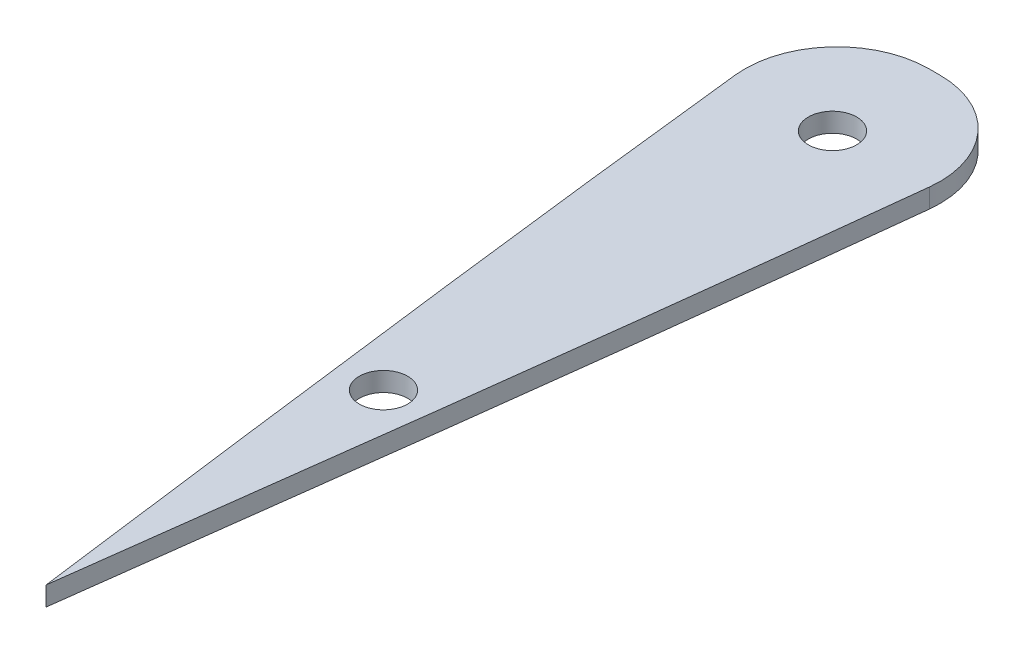
ISO-10303-21;
HEADER;
FILE_DESCRIPTION(('STEP AP214'),'2;1');
FILE_NAME('part.step','',(''),(''),'','','');
FILE_SCHEMA(('AUTOMOTIVE_DESIGN { 1 0 10303 214 1 1 1 1 }'));
ENDSEC;
DATA;
#1=APPLICATION_CONTEXT('core data for automotive mechanical design processes');
#2=APPLICATION_PROTOCOL_DEFINITION('international standard','automotive_design',2000,#1);
#3=PRODUCT_CONTEXT('',#1,'mechanical');
#4=PRODUCT('Part','Part','',(#3));
#5=PRODUCT_RELATED_PRODUCT_CATEGORY('part','',(#4));
#6=PRODUCT_DEFINITION_FORMATION('','',#4);
#7=PRODUCT_DEFINITION_CONTEXT('part definition',#1,'design');
#8=PRODUCT_DEFINITION('design','',#6,#7);
#9=PRODUCT_DEFINITION_SHAPE('','',#8);
#10=(LENGTH_UNIT() NAMED_UNIT(*) SI_UNIT(.MILLI.,.METRE.));
#11=(NAMED_UNIT(*) PLANE_ANGLE_UNIT() SI_UNIT($,.RADIAN.));
#12=(NAMED_UNIT(*) SI_UNIT($,.STERADIAN.) SOLID_ANGLE_UNIT());
#13=UNCERTAINTY_MEASURE_WITH_UNIT(LENGTH_MEASURE(1.E-05),#10,'distance_accuracy_value','');
#14=(GEOMETRIC_REPRESENTATION_CONTEXT(3) GLOBAL_UNCERTAINTY_ASSIGNED_CONTEXT((#13)) GLOBAL_UNIT_ASSIGNED_CONTEXT((#10,
#11,#12)) REPRESENTATION_CONTEXT('',''));
#15=CARTESIAN_POINT('',(0.,0.,0.));
#16=DIRECTION('',(0.,0.,1.));
#17=DIRECTION('',(1.,0.,0.));
#18=AXIS2_PLACEMENT_3D('',#15,#16,#17);
#19=CARTESIAN_POINT('',(1.10809611059364,169.87266,71.9337783562964));
#20=DIRECTION('',(0.,-1.,0.));
#21=DIRECTION('',(0.,0.,-1.));
#22=AXIS2_PLACEMENT_3D('',#19,#20,#21);
#23=CYLINDRICAL_SURFACE('',#22,2.);
#24=CARTESIAN_POINT('',(1.10809611059364,159.28483333274,71.9337783562964));
#25=DIRECTION('',(0.,1.,0.));
#26=DIRECTION('',(0.,0.,1.));
#27=AXIS2_PLACEMENT_3D('',#24,#25,#26);
#28=CIRCLE('',#27,2.);
#29=CARTESIAN_POINT('',(1.10809611059364,159.28483333274,69.9337783562964));
#30=VERTEX_POINT('',#29);
#31=EDGE_CURVE('E43',#30,#30,#28,.F.);
#32=CARTESIAN_POINT('',(1.10809611059364,160.87233333274,71.9337783562964));
#33=DIRECTION('',(0.,-1.,0.));
#34=DIRECTION('',(0.,0.,-1.));
#35=AXIS2_PLACEMENT_3D('',#32,#33,#34);
#36=CIRCLE('',#35,2.);
#37=CARTESIAN_POINT('',(1.10809611059364,160.87233333274,69.9337783562964));
#38=VERTEX_POINT('',#37);
#39=EDGE_CURVE('E130',#38,#38,#36,.F.);
#40=CARTESIAN_POINT('',(1.10809611059364,159.28483333274,69.9337783562964));
#41=CARTESIAN_POINT('',(1.10809611059364,159.301369791073,69.9337783562964));
#42=CARTESIAN_POINT('',(1.10809611059364,159.317906249407,69.9337783562964));
#43=CARTESIAN_POINT('',(1.10809611059364,159.350979166073,69.9337783562964));
#44=CARTESIAN_POINT('',(1.10809611059364,159.367515624407,69.9337783562964));
#45=CARTESIAN_POINT('',(1.10809611059364,159.400588541073,69.9337783562964));
#46=CARTESIAN_POINT('',(1.10809611059364,159.417124999407,69.9337783562964));
#47=CARTESIAN_POINT('',(1.10809611059364,159.450197916073,69.9337783562964));
#48=CARTESIAN_POINT('',(1.10809611059364,159.466734374407,69.9337783562964));
#49=CARTESIAN_POINT('',(1.10809611059364,159.499807291073,69.9337783562964));
#50=CARTESIAN_POINT('',(1.10809611059364,159.516343749407,69.9337783562964));
#51=CARTESIAN_POINT('',(1.10809611059364,159.549416666073,69.9337783562964));
#52=CARTESIAN_POINT('',(1.10809611059364,159.565953124407,69.9337783562964));
#53=CARTESIAN_POINT('',(1.10809611059364,159.599026041073,69.9337783562964));
#54=CARTESIAN_POINT('',(1.10809611059364,159.615562499407,69.9337783562964));
#55=CARTESIAN_POINT('',(1.10809611059364,159.648635416073,69.9337783562964));
#56=CARTESIAN_POINT('',(1.10809611059364,159.665171874407,69.9337783562964));
#57=CARTESIAN_POINT('',(1.10809611059364,159.698244791073,69.9337783562964));
#58=CARTESIAN_POINT('',(1.10809611059364,159.714781249407,69.9337783562964));
#59=CARTESIAN_POINT('',(1.10809611059364,159.747854166073,69.9337783562964));
#60=CARTESIAN_POINT('',(1.10809611059364,159.764390624407,69.9337783562964));
#61=CARTESIAN_POINT('',(1.10809611059364,159.797463541073,69.9337783562964));
#62=CARTESIAN_POINT('',(1.10809611059364,159.813999999407,69.9337783562964));
#63=CARTESIAN_POINT('',(1.10809611059364,159.847072916073,69.9337783562964));
#64=CARTESIAN_POINT('',(1.10809611059364,159.863609374407,69.9337783562964));
#65=CARTESIAN_POINT('',(1.10809611059364,159.896682291073,69.9337783562964));
#66=CARTESIAN_POINT('',(1.10809611059364,159.913218749407,69.9337783562964));
#67=CARTESIAN_POINT('',(1.10809611059364,159.946291666073,69.9337783562964));
#68=CARTESIAN_POINT('',(1.10809611059364,159.962828124407,69.9337783562964));
#69=CARTESIAN_POINT('',(1.10809611059364,159.995901041073,69.9337783562964));
#70=CARTESIAN_POINT('',(1.10809611059364,160.012437499407,69.9337783562964));
#71=CARTESIAN_POINT('',(1.10809611059364,160.045510416073,69.9337783562964));
#72=CARTESIAN_POINT('',(1.10809611059364,160.062046874407,69.9337783562964));
#73=CARTESIAN_POINT('',(1.10809611059364,160.095119791073,69.9337783562964));
#74=CARTESIAN_POINT('',(1.10809611059364,160.111656249407,69.9337783562964));
#75=CARTESIAN_POINT('',(1.10809611059364,160.144729166073,69.9337783562964));
#76=CARTESIAN_POINT('',(1.10809611059364,160.161265624407,69.9337783562964));
#77=CARTESIAN_POINT('',(1.10809611059364,160.194338541073,69.9337783562964));
#78=CARTESIAN_POINT('',(1.10809611059364,160.210874999407,69.9337783562964));
#79=CARTESIAN_POINT('',(1.10809611059364,160.243947916073,69.9337783562964));
#80=CARTESIAN_POINT('',(1.10809611059364,160.260484374407,69.9337783562964));
#81=CARTESIAN_POINT('',(1.10809611059364,160.293557291073,69.9337783562964));
#82=CARTESIAN_POINT('',(1.10809611059364,160.310093749407,69.9337783562964));
#83=CARTESIAN_POINT('',(1.10809611059364,160.343166666073,69.9337783562964));
#84=CARTESIAN_POINT('',(1.10809611059364,160.359703124407,69.9337783562964));
#85=CARTESIAN_POINT('',(1.10809611059364,160.392776041073,69.9337783562964));
#86=CARTESIAN_POINT('',(1.10809611059364,160.409312499407,69.9337783562964));
#87=CARTESIAN_POINT('',(1.10809611059364,160.442385416073,69.9337783562964));
#88=CARTESIAN_POINT('',(1.10809611059364,160.458921874407,69.9337783562964));
#89=CARTESIAN_POINT('',(1.10809611059364,160.491994791073,69.9337783562964));
#90=CARTESIAN_POINT('',(1.10809611059364,160.508531249407,69.9337783562964));
#91=CARTESIAN_POINT('',(1.10809611059364,160.541604166073,69.9337783562964));
#92=CARTESIAN_POINT('',(1.10809611059364,160.558140624407,69.9337783562964));
#93=CARTESIAN_POINT('',(1.10809611059364,160.591213541073,69.9337783562964));
#94=CARTESIAN_POINT('',(1.10809611059364,160.607749999407,69.9337783562964));
#95=CARTESIAN_POINT('',(1.10809611059364,160.640822916073,69.9337783562964));
#96=CARTESIAN_POINT('',(1.10809611059364,160.657359374407,69.9337783562964));
#97=CARTESIAN_POINT('',(1.10809611059364,160.690432291073,69.9337783562964));
#98=CARTESIAN_POINT('',(1.10809611059364,160.706968749407,69.9337783562964));
#99=CARTESIAN_POINT('',(1.10809611059364,160.740041666073,69.9337783562964));
#100=CARTESIAN_POINT('',(1.10809611059364,160.756578124407,69.9337783562964));
#101=CARTESIAN_POINT('',(1.10809611059364,160.789651041073,69.9337783562964));
#102=CARTESIAN_POINT('',(1.10809611059364,160.806187499407,69.9337783562964));
#103=CARTESIAN_POINT('',(1.10809611059364,160.839260416073,69.9337783562964));
#104=CARTESIAN_POINT('',(1.10809611059364,160.855796874407,69.9337783562964));
#105=CARTESIAN_POINT('',(1.10809611059364,160.87233333274,69.9337783562964));
#106=B_SPLINE_CURVE_WITH_KNOTS('',3,(#40,#41,#42,#43,#44,#45,#46,#47,#48,#49,#50,#51,#52,#53,
#54,#55,#56,#57,#58,#59,#60,#61,#62,#63,#64,#65,#66,#67,#68,#69,#70,#71,#72,#73,#74,#75,#76,#77,
#78,#79,#80,#81,#82,#83,#84,#85,#86,#87,#88,#89,#90,#91,#92,#93,#94,#95,#96,#97,#98,#99,#100,
#101,#102,#103,#104,#105),.UNSPECIFIED.,.F.,.F.,(4,2,2,2,2,2,2,2,2,2,2,2,2,2,2,2,2,2,2,2,2,2,2,
2,2,2,2,2,2,2,2,2,4),(0.,0.0496093750000093,0.0992187500000186,0.148828125000028,
0.198437500000009,0.248046875000019,0.297656250000028,0.347265625000009,0.396875000000019,
0.446484375000028,0.49609375000001,0.545703125000019,0.595312500000028,0.64492187500001,
0.694531250000019,0.744140625000028,0.79375000000001,0.843359375000019,0.892968750000028,
0.94257812500001,0.992187500000019,1.04179687500003,1.09140625000004,1.14101562500002,
1.19062500000003,1.24023437500004,1.28984375000002,1.33945312500003,1.38906250000004,
1.43867187500002,1.48828125000003,1.53789062500004,1.58750000000002),.UNSPECIFIED.);
#107=EDGE_CURVE('BSEAM39',#30,#38,#106,.T.);
#108=ORIENTED_EDGE('',*,*,#31,.T.);
#109=ORIENTED_EDGE('',*,*,#39,.T.);
#110=ORIENTED_EDGE('',*,*,#107,.T.);
#111=ORIENTED_EDGE('',*,*,#107,.F.);
#112=EDGE_LOOP('',(#108,#110,#109,#111));
#113=FACE_BOUND('',#112,.T.);
#114=ADVANCED_FACE('F39',(#113),#23,.F.);
#115=CARTESIAN_POINT('',(-9.25951888196291,160.87233333274,99.8737783562964));
#116=DIRECTION('',(0.,-1.,0.));
#117=DIRECTION('',(0.,0.,-1.));
#118=AXIS2_PLACEMENT_3D('',#115,#116,#117);
#119=PLANE('',#118);
#120=CARTESIAN_POINT('',(0.649492403151799,160.87233333274,33.932456678177));
#121=DIRECTION('',(0.,-1.,0.));
#122=DIRECTION('',(0.,0.,-1.));
#123=AXIS2_PLACEMENT_3D('',#120,#121,#122);
#124=CIRCLE('',#123,7.62);
#125=CARTESIAN_POINT('',(0.6494924031518,160.87233333274,26.312456678177));
#126=VERTEX_POINT('',#125);
#127=CARTESIAN_POINT('',(-6.9253777548343,160.87233333274,34.7605521374397));
#128=VERTEX_POINT('',#127);
#129=EDGE_CURVE('E91',#126,#128,#124,.F.);
#130=ORIENTED_EDGE('',*,*,#129,.T.);
#131=CARTESIAN_POINT('',(-8.38670742850917,160.87233333274,20.7524515728352));
#132=CARTESIAN_POINT('',(-5.77036767929202,160.87233333274,47.1872196515421));
#133=CARTESIAN_POINT('',(-2.31115252231645,160.87233333274,73.5317641629202));
#134=CARTESIAN_POINT('',(1.10809611059364,160.87233333274,99.8737783562964));
#135=B_SPLINE_CURVE_WITH_KNOTS('',3,(#131,#132,#133,#134),.UNSPECIFIED.,.F.,.F.,(4,4),(0.,
0.384969625903912),.UNSPECIFIED.);
#136=CARTESIAN_POINT('',(1.10809611059364,160.87233333274,99.8737783562964));
#137=VERTEX_POINT('',#136);
#138=EDGE_CURVE('E87',#137,#128,#135,.F.);
#139=ORIENTED_EDGE('',*,*,#138,.F.);
#140=CARTESIAN_POINT('',(1.10809611059364,160.87233333274,99.8737783562964));
#141=CARTESIAN_POINT('',(4.52734474351301,160.87233333274,73.5317641629186));
#142=CARTESIAN_POINT('',(7.98655990047842,160.87233333274,47.187219651543));
#143=CARTESIAN_POINT('',(10.6028996496958,160.87233333274,20.7524515728353));
#144=B_SPLINE_CURVE_WITH_KNOTS('',3,(#140,#141,#142,#143),.UNSPECIFIED.,.F.,.F.,(4,4),(0.,
0.384969625903911),.UNSPECIFIED.);
#145=CARTESIAN_POINT('',(9.14156997602183,160.87233333274,34.7605521374382));
#146=VERTEX_POINT('',#145);
#147=EDGE_CURVE('E57',#146,#137,#144,.F.);
#148=ORIENTED_EDGE('',*,*,#147,.F.);
#149=CARTESIAN_POINT('',(1.56669981803556,160.87233333274,33.932456678177));
#150=DIRECTION('',(0.,-1.,0.));
#151=DIRECTION('',(0.,0.,-1.));
#152=AXIS2_PLACEMENT_3D('',#149,#150,#151);
#153=CIRCLE('',#152,7.62);
#154=CARTESIAN_POINT('',(1.56669981803556,160.87233333274,26.312456678177));
#155=VERTEX_POINT('',#154);
#156=EDGE_CURVE('E138',#146,#155,#153,.F.);
#157=ORIENTED_EDGE('',*,*,#156,.T.);
#158=DIRECTION('',(1.,0.,0.));
#159=VECTOR('',#158,1.);
#160=CARTESIAN_POINT('',(-9.95528734648911,160.87233333274,26.312456678177));
#161=LINE('',#160,#159);
#162=EDGE_CURVE('E107',#126,#155,#161,.T.);
#163=ORIENTED_EDGE('',*,*,#162,.F.);
#164=EDGE_LOOP('',(#130,#139,#148,#157,#163));
#165=FACE_BOUND('',#164,.T.);
#166=ORIENTED_EDGE('',*,*,#39,.F.);
#167=EDGE_LOOP('',(#166));
#168=FACE_BOUND('',#167,.T.);
#169=CARTESIAN_POINT('',(1.10809611059364,160.87233333274,34.7605521374395));
#170=DIRECTION('',(0.,-1.,0.));
#171=DIRECTION('',(0.,0.,-1.));
#172=AXIS2_PLACEMENT_3D('',#169,#170,#171);
#173=CIRCLE('',#172,2.);
#174=CARTESIAN_POINT('',(1.10809611059364,160.87233333274,32.7605521374395));
#175=VERTEX_POINT('',#174);
#176=EDGE_CURVE('E133',#175,#175,#173,.F.);
#177=ORIENTED_EDGE('',*,*,#176,.F.);
#178=EDGE_LOOP('',(#177));
#179=FACE_BOUND('',#178,.T.);
#180=ADVANCED_FACE('F88',(#165,#168,#179),#119,.F.);
#181=CARTESIAN_POINT('',(-9.25951888196291,159.28483333274,99.8737783562964));
#182=DIRECTION('',(0.,1.,0.));
#183=DIRECTION('',(0.,0.,1.));
#184=AXIS2_PLACEMENT_3D('',#181,#182,#183);
#185=PLANE('',#184);
#186=CARTESIAN_POINT('',(0.649492403151799,159.28483333274,33.932456678177));
#187=DIRECTION('',(0.,1.,0.));
#188=DIRECTION('',(0.,0.,1.));
#189=AXIS2_PLACEMENT_3D('',#186,#187,#188);
#190=CIRCLE('',#189,7.62);
#191=CARTESIAN_POINT('',(-6.9253777548343,159.28483333274,34.7605521374397));
#192=VERTEX_POINT('',#191);
#193=CARTESIAN_POINT('',(0.6494924031518,159.28483333274,26.312456678177));
#194=VERTEX_POINT('',#193);
#195=EDGE_CURVE('E114',#192,#194,#190,.F.);
#196=ORIENTED_EDGE('',*,*,#195,.T.);
#197=DIRECTION('',(-1.,0.,0.));
#198=VECTOR('',#197,1.);
#199=CARTESIAN_POINT('',(-9.95528734648911,159.28483333274,26.312456678177));
#200=LINE('',#199,#198);
#201=CARTESIAN_POINT('',(1.56669981803556,159.28483333274,26.312456678177));
#202=VERTEX_POINT('',#201);
#203=EDGE_CURVE('E65',#202,#194,#200,.T.);
#204=ORIENTED_EDGE('',*,*,#203,.F.);
#205=CARTESIAN_POINT('',(1.56669981803556,159.28483333274,33.932456678177));
#206=DIRECTION('',(0.,1.,0.));
#207=DIRECTION('',(0.,0.,1.));
#208=AXIS2_PLACEMENT_3D('',#205,#206,#207);
#209=CIRCLE('',#208,7.62);
#210=CARTESIAN_POINT('',(9.1415699760218,159.28483333274,34.7605521374385));
#211=VERTEX_POINT('',#210);
#212=EDGE_CURVE('E164',#202,#211,#209,.F.);
#213=ORIENTED_EDGE('',*,*,#212,.T.);
#214=CARTESIAN_POINT('',(1.10809611059364,159.28483333274,99.8737783562964));
#215=CARTESIAN_POINT('',(4.52734474351301,159.28483333274,73.5317641629186));
#216=CARTESIAN_POINT('',(7.98655990047842,159.28483333274,47.187219651543));
#217=CARTESIAN_POINT('',(10.6028996496958,159.28483333274,20.7524515728353));
#218=B_SPLINE_CURVE_WITH_KNOTS('',3,(#214,#215,#216,#217),.UNSPECIFIED.,.F.,.F.,(4,4),(0.,
0.384969625903911),.UNSPECIFIED.);
#219=CARTESIAN_POINT('',(1.10809611059364,159.28483333274,99.8737783562964));
#220=VERTEX_POINT('',#219);
#221=EDGE_CURVE('E169',#220,#211,#218,.T.);
#222=ORIENTED_EDGE('',*,*,#221,.F.);
#223=CARTESIAN_POINT('',(-8.38670742850917,159.28483333274,20.7524515728352));
#224=CARTESIAN_POINT('',(-5.77036767929202,159.28483333274,47.1872196515421));
#225=CARTESIAN_POINT('',(-2.31115252231645,159.28483333274,73.5317641629202));
#226=CARTESIAN_POINT('',(1.10809611059364,159.28483333274,99.8737783562964));
#227=B_SPLINE_CURVE_WITH_KNOTS('',3,(#223,#224,#225,#226),.UNSPECIFIED.,.F.,.F.,(4,4),(0.,
0.384969625903912),.UNSPECIFIED.);
#228=EDGE_CURVE('E111',#192,#220,#227,.T.);
#229=ORIENTED_EDGE('',*,*,#228,.F.);
#230=EDGE_LOOP('',(#196,#204,#213,#222,#229));
#231=FACE_BOUND('',#230,.T.);
#232=ORIENTED_EDGE('',*,*,#31,.F.);
#233=EDGE_LOOP('',(#232));
#234=FACE_BOUND('',#233,.T.);
#235=CARTESIAN_POINT('',(1.10809611059364,159.28483333274,34.7605521374395));
#236=DIRECTION('',(0.,1.,0.));
#237=DIRECTION('',(0.,0.,1.));
#238=AXIS2_PLACEMENT_3D('',#235,#236,#237);
#239=CIRCLE('',#238,2.);
#240=CARTESIAN_POINT('',(1.10809611059364,159.28483333274,32.7605521374395));
#241=VERTEX_POINT('',#240);
#242=EDGE_CURVE('E160',#241,#241,#239,.F.);
#243=ORIENTED_EDGE('',*,*,#242,.F.);
#244=EDGE_LOOP('',(#243));
#245=FACE_BOUND('',#244,.T.);
#246=ADVANCED_FACE('F211',(#231,#234,#245),#185,.F.);
#247=CARTESIAN_POINT('',(1.10809611059364,169.87266,34.7605521374395));
#248=DIRECTION('',(0.,-1.,0.));
#249=DIRECTION('',(0.,0.,-1.));
#250=AXIS2_PLACEMENT_3D('',#247,#248,#249);
#251=CYLINDRICAL_SURFACE('',#250,2.);
#252=CARTESIAN_POINT('',(1.10809611059364,159.28483333274,32.7605521374395));
#253=CARTESIAN_POINT('',(1.10809611059364,159.301369791073,32.7605521374395));
#254=CARTESIAN_POINT('',(1.10809611059364,159.317906249407,32.7605521374395));
#255=CARTESIAN_POINT('',(1.10809611059364,159.350979166073,32.7605521374395));
#256=CARTESIAN_POINT('',(1.10809611059364,159.367515624407,32.7605521374395));
#257=CARTESIAN_POINT('',(1.10809611059364,159.400588541073,32.7605521374395));
#258=CARTESIAN_POINT('',(1.10809611059364,159.417124999407,32.7605521374395));
#259=CARTESIAN_POINT('',(1.10809611059364,159.450197916073,32.7605521374395));
#260=CARTESIAN_POINT('',(1.10809611059364,159.466734374407,32.7605521374395));
#261=CARTESIAN_POINT('',(1.10809611059364,159.499807291073,32.7605521374395));
#262=CARTESIAN_POINT('',(1.10809611059364,159.516343749407,32.7605521374395));
#263=CARTESIAN_POINT('',(1.10809611059364,159.549416666073,32.7605521374395));
#264=CARTESIAN_POINT('',(1.10809611059364,159.565953124407,32.7605521374395));
#265=CARTESIAN_POINT('',(1.10809611059364,159.599026041073,32.7605521374395));
#266=CARTESIAN_POINT('',(1.10809611059364,159.615562499407,32.7605521374395));
#267=CARTESIAN_POINT('',(1.10809611059364,159.648635416073,32.7605521374395));
#268=CARTESIAN_POINT('',(1.10809611059364,159.665171874407,32.7605521374395));
#269=CARTESIAN_POINT('',(1.10809611059364,159.698244791073,32.7605521374395));
#270=CARTESIAN_POINT('',(1.10809611059364,159.714781249407,32.7605521374395));
#271=CARTESIAN_POINT('',(1.10809611059364,159.747854166073,32.7605521374395));
#272=CARTESIAN_POINT('',(1.10809611059364,159.764390624407,32.7605521374395));
#273=CARTESIAN_POINT('',(1.10809611059364,159.797463541073,32.7605521374395));
#274=CARTESIAN_POINT('',(1.10809611059364,159.813999999407,32.7605521374395));
#275=CARTESIAN_POINT('',(1.10809611059364,159.847072916073,32.7605521374395));
#276=CARTESIAN_POINT('',(1.10809611059364,159.863609374407,32.7605521374395));
#277=CARTESIAN_POINT('',(1.10809611059364,159.896682291073,32.7605521374395));
#278=CARTESIAN_POINT('',(1.10809611059364,159.913218749407,32.7605521374395));
#279=CARTESIAN_POINT('',(1.10809611059364,159.946291666073,32.7605521374395));
#280=CARTESIAN_POINT('',(1.10809611059364,159.962828124407,32.7605521374395));
#281=CARTESIAN_POINT('',(1.10809611059364,159.995901041073,32.7605521374395));
#282=CARTESIAN_POINT('',(1.10809611059364,160.012437499407,32.7605521374395));
#283=CARTESIAN_POINT('',(1.10809611059364,160.045510416073,32.7605521374395));
#284=CARTESIAN_POINT('',(1.10809611059364,160.062046874407,32.7605521374395));
#285=CARTESIAN_POINT('',(1.10809611059364,160.095119791073,32.7605521374395));
#286=CARTESIAN_POINT('',(1.10809611059364,160.111656249407,32.7605521374395));
#287=CARTESIAN_POINT('',(1.10809611059364,160.144729166073,32.7605521374395));
#288=CARTESIAN_POINT('',(1.10809611059364,160.161265624407,32.7605521374395));
#289=CARTESIAN_POINT('',(1.10809611059364,160.194338541073,32.7605521374395));
#290=CARTESIAN_POINT('',(1.10809611059364,160.210874999407,32.7605521374395));
#291=CARTESIAN_POINT('',(1.10809611059364,160.243947916073,32.7605521374395));
#292=CARTESIAN_POINT('',(1.10809611059364,160.260484374407,32.7605521374395));
#293=CARTESIAN_POINT('',(1.10809611059364,160.293557291073,32.7605521374395));
#294=CARTESIAN_POINT('',(1.10809611059364,160.310093749407,32.7605521374395));
#295=CARTESIAN_POINT('',(1.10809611059364,160.343166666073,32.7605521374395));
#296=CARTESIAN_POINT('',(1.10809611059364,160.359703124407,32.7605521374395));
#297=CARTESIAN_POINT('',(1.10809611059364,160.392776041073,32.7605521374395));
#298=CARTESIAN_POINT('',(1.10809611059364,160.409312499407,32.7605521374395));
#299=CARTESIAN_POINT('',(1.10809611059364,160.442385416073,32.7605521374395));
#300=CARTESIAN_POINT('',(1.10809611059364,160.458921874407,32.7605521374395));
#301=CARTESIAN_POINT('',(1.10809611059364,160.491994791073,32.7605521374395));
#302=CARTESIAN_POINT('',(1.10809611059364,160.508531249407,32.7605521374395));
#303=CARTESIAN_POINT('',(1.10809611059364,160.541604166073,32.7605521374395));
#304=CARTESIAN_POINT('',(1.10809611059364,160.558140624407,32.7605521374395));
#305=CARTESIAN_POINT('',(1.10809611059364,160.591213541073,32.7605521374395));
#306=CARTESIAN_POINT('',(1.10809611059364,160.607749999407,32.7605521374395));
#307=CARTESIAN_POINT('',(1.10809611059364,160.640822916073,32.7605521374395));
#308=CARTESIAN_POINT('',(1.10809611059364,160.657359374407,32.7605521374395));
#309=CARTESIAN_POINT('',(1.10809611059364,160.690432291073,32.7605521374395));
#310=CARTESIAN_POINT('',(1.10809611059364,160.706968749407,32.7605521374395));
#311=CARTESIAN_POINT('',(1.10809611059364,160.740041666073,32.7605521374395));
#312=CARTESIAN_POINT('',(1.10809611059364,160.756578124407,32.7605521374395));
#313=CARTESIAN_POINT('',(1.10809611059364,160.789651041073,32.7605521374395));
#314=CARTESIAN_POINT('',(1.10809611059364,160.806187499407,32.7605521374395));
#315=CARTESIAN_POINT('',(1.10809611059364,160.839260416073,32.7605521374395));
#316=CARTESIAN_POINT('',(1.10809611059364,160.855796874407,32.7605521374395));
#317=CARTESIAN_POINT('',(1.10809611059364,160.87233333274,32.7605521374395));
#318=B_SPLINE_CURVE_WITH_KNOTS('',3,(#252,#253,#254,#255,#256,#257,#258,#259,#260,#261,#262,
#263,#264,#265,#266,#267,#268,#269,#270,#271,#272,#273,#274,#275,#276,#277,#278,#279,#280,#281,
#282,#283,#284,#285,#286,#287,#288,#289,#290,#291,#292,#293,#294,#295,#296,#297,#298,#299,#300,
#301,#302,#303,#304,#305,#306,#307,#308,#309,#310,#311,#312,#313,#314,#315,#316,#317),
.UNSPECIFIED.,.F.,.F.,(4,2,2,2,2,2,2,2,2,2,2,2,2,2,2,2,2,2,2,2,2,2,2,2,2,2,2,2,2,2,2,2,4),(0.,
0.0496093750000093,0.0992187500000186,0.148828125000028,0.198437500000009,0.248046875000019,
0.297656250000028,0.347265625000009,0.396875000000019,0.446484375000028,0.49609375000001,
0.545703125000019,0.595312500000028,0.64492187500001,0.694531250000019,0.744140625000028,
0.79375000000001,0.843359375000019,0.892968750000028,0.94257812500001,0.992187500000019,
1.04179687500003,1.09140625000004,1.14101562500002,1.19062500000003,1.24023437500004,
1.28984375000002,1.33945312500003,1.38906250000004,1.43867187500002,1.48828125000003,
1.53789062500004,1.58750000000002),.UNSPECIFIED.);
#319=EDGE_CURVE('BSEAM192',#241,#175,#318,.T.);
#320=ORIENTED_EDGE('',*,*,#242,.T.);
#321=ORIENTED_EDGE('',*,*,#176,.T.);
#322=ORIENTED_EDGE('',*,*,#319,.T.);
#323=ORIENTED_EDGE('',*,*,#319,.F.);
#324=EDGE_LOOP('',(#320,#322,#321,#323));
#325=FACE_BOUND('',#324,.T.);
#326=ADVANCED_FACE('F192',(#325),#251,.F.);
#327=CARTESIAN_POINT('',(-8.38670742850917,169.87266,20.7524515728352));
#328=CARTESIAN_POINT('',(-5.77036767929202,169.87266,47.1872196515421));
#329=CARTESIAN_POINT('',(-2.31115252231645,169.87266,73.5317641629202));
#330=CARTESIAN_POINT('',(1.10809611059364,169.87266,99.8737783562964));
#331=B_SPLINE_CURVE_WITH_KNOTS('',3,(#327,#328,#329,#330),.UNSPECIFIED.,.F.,.F.,(4,4),(0.,
0.384969625903912),.UNSPECIFIED.);
#332=DIRECTION('',(0.,-1.,0.));
#333=VECTOR('',#332,1.);
#334=SURFACE_OF_LINEAR_EXTRUSION('',#331,#333);
#335=DIRECTION('',(0.,-1.,0.));
#336=VECTOR('',#335,1.);
#337=CARTESIAN_POINT('',(-6.92537775483439,169.87266,34.7605521374389));
#338=LINE('',#337,#336);
#339=EDGE_CURVE('E113',#128,#192,#338,.T.);
#340=ORIENTED_EDGE('',*,*,#339,.T.);
#341=ORIENTED_EDGE('',*,*,#228,.T.);
#342=DIRECTION('',(0.,-1.,0.));
#343=VECTOR('',#342,1.);
#344=CARTESIAN_POINT('',(1.10809611059364,169.87266,99.8737783562964));
#345=LINE('',#344,#343);
#346=EDGE_CURVE('E103',#137,#220,#345,.T.);
#347=ORIENTED_EDGE('',*,*,#346,.F.);
#348=ORIENTED_EDGE('',*,*,#138,.T.);
#349=EDGE_LOOP('',(#340,#341,#347,#348));
#350=FACE_BOUND('',#349,.T.);
#351=ADVANCED_FACE('F110',(#350),#334,.F.);
#352=CARTESIAN_POINT('',(1.10809611059364,169.87266,99.8737783562964));
#353=CARTESIAN_POINT('',(4.52734474351301,169.87266,73.5317641629186));
#354=CARTESIAN_POINT('',(7.98655990047842,169.87266,47.187219651543));
#355=CARTESIAN_POINT('',(10.6028996496958,169.87266,20.7524515728353));
#356=B_SPLINE_CURVE_WITH_KNOTS('',3,(#352,#353,#354,#355),.UNSPECIFIED.,.F.,.F.,(4,4),(0.,
0.384969625903911),.UNSPECIFIED.);
#357=DIRECTION('',(0.,-1.,0.));
#358=VECTOR('',#357,1.);
#359=SURFACE_OF_LINEAR_EXTRUSION('',#356,#358);
#360=ORIENTED_EDGE('',*,*,#346,.T.);
#361=ORIENTED_EDGE('',*,*,#221,.T.);
#362=DIRECTION('',(0.,-1.,0.));
#363=VECTOR('',#362,1.);
#364=CARTESIAN_POINT('',(9.14156997602183,146.81454,34.7605521374382));
#365=LINE('',#364,#363);
#366=EDGE_CURVE('E105',#211,#146,#365,.F.);
#367=ORIENTED_EDGE('',*,*,#366,.T.);
#368=ORIENTED_EDGE('',*,*,#147,.T.);
#369=EDGE_LOOP('',(#360,#361,#367,#368));
#370=FACE_BOUND('',#369,.T.);
#371=ADVANCED_FACE('F101',(#370),#359,.F.);
#372=CARTESIAN_POINT('',(-9.95528734648911,146.81454,26.312456678177));
#373=DIRECTION('',(0.,0.,1.));
#374=DIRECTION('',(1.,0.,0.));
#375=AXIS2_PLACEMENT_3D('',#372,#373,#374);
#376=PLANE('',#375);
#377=DIRECTION('',(0.,-1.,0.));
#378=VECTOR('',#377,1.);
#379=CARTESIAN_POINT('',(1.56669981803556,146.81454,26.312456678177));
#380=LINE('',#379,#378);
#381=EDGE_CURVE('E49',#155,#202,#380,.T.);
#382=ORIENTED_EDGE('',*,*,#381,.T.);
#383=ORIENTED_EDGE('',*,*,#203,.T.);
#384=DIRECTION('',(0.,-1.,0.));
#385=VECTOR('',#384,1.);
#386=CARTESIAN_POINT('',(0.6494924031518,146.81454,26.312456678177));
#387=LINE('',#386,#385);
#388=EDGE_CURVE('E11',#194,#126,#387,.F.);
#389=ORIENTED_EDGE('',*,*,#388,.T.);
#390=ORIENTED_EDGE('',*,*,#162,.T.);
#391=EDGE_LOOP('',(#382,#383,#389,#390));
#392=FACE_BOUND('',#391,.T.);
#393=ADVANCED_FACE('F196',(#392),#376,.F.);
#394=CARTESIAN_POINT('',(0.649492403151799,158.3436,33.932456678177));
#395=DIRECTION('',(0.,-1.,0.));
#396=DIRECTION('',(0.,0.,-1.));
#397=AXIS2_PLACEMENT_3D('',#394,#395,#396);
#398=CYLINDRICAL_SURFACE('',#397,7.62);
#399=ORIENTED_EDGE('',*,*,#195,.F.);
#400=ORIENTED_EDGE('',*,*,#339,.F.);
#401=ORIENTED_EDGE('',*,*,#129,.F.);
#402=ORIENTED_EDGE('',*,*,#388,.F.);
#403=EDGE_LOOP('',(#399,#400,#401,#402));
#404=FACE_BOUND('',#403,.T.);
#405=ADVANCED_FACE('F194',(#404),#398,.T.);
#406=CARTESIAN_POINT('',(1.56669981803556,158.3436,33.932456678177));
#407=DIRECTION('',(0.,-1.,0.));
#408=DIRECTION('',(0.,0.,-1.));
#409=AXIS2_PLACEMENT_3D('',#406,#407,#408);
#410=CYLINDRICAL_SURFACE('',#409,7.62);
#411=ORIENTED_EDGE('',*,*,#212,.F.);
#412=ORIENTED_EDGE('',*,*,#381,.F.);
#413=ORIENTED_EDGE('',*,*,#156,.F.);
#414=ORIENTED_EDGE('',*,*,#366,.F.);
#415=EDGE_LOOP('',(#411,#412,#413,#414));
#416=FACE_BOUND('',#415,.T.);
#417=ADVANCED_FACE('F41',(#416),#410,.T.);
#418=CLOSED_SHELL('',(#114,#180,#246,#326,#351,#371,#393,#405,#417));
#419=MANIFOLD_SOLID_BREP('B2',#418);
#420=ADVANCED_BREP_SHAPE_REPRESENTATION('',(#18,#419),#14);
#421=SHAPE_DEFINITION_REPRESENTATION(#9,#420);
ENDSEC;
END-ISO-10303-21;
